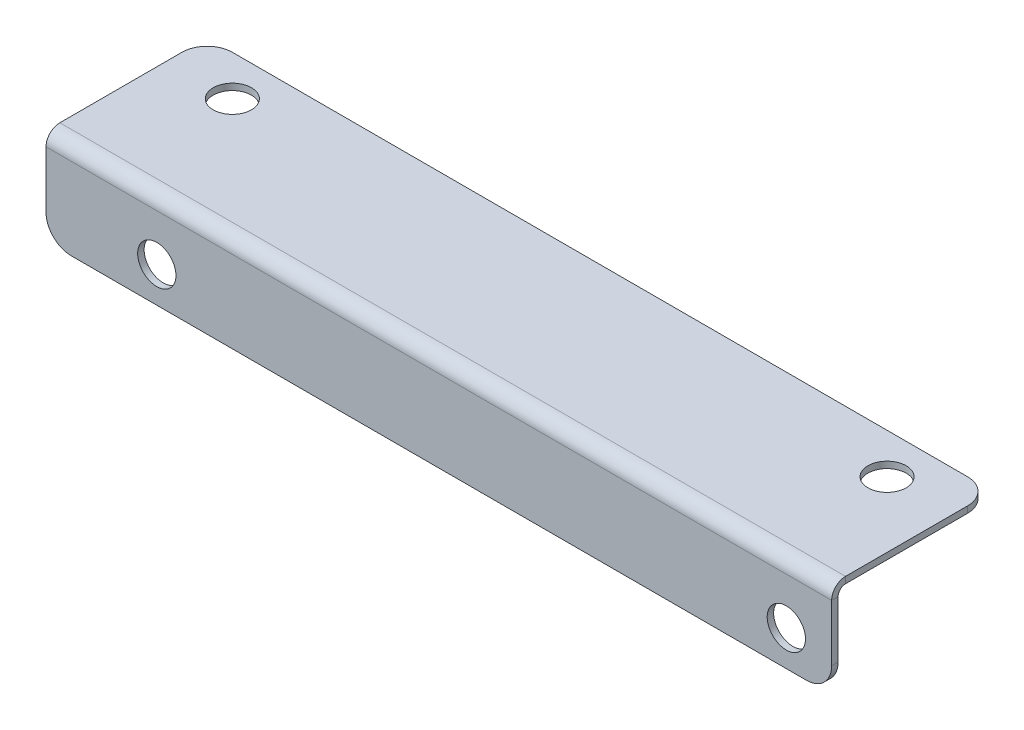
ISO-10303-21;
HEADER;
FILE_DESCRIPTION(('STEP AP214'),'2;1');
FILE_NAME('part.step','',(''),(''),'','','');
FILE_SCHEMA(('AUTOMOTIVE_DESIGN { 1 0 10303 214 1 1 1 1 }'));
ENDSEC;
DATA;
#1=APPLICATION_CONTEXT('core data for automotive mechanical design processes');
#2=APPLICATION_PROTOCOL_DEFINITION('international standard','automotive_design',2000,#1);
#3=PRODUCT_CONTEXT('',#1,'mechanical');
#4=PRODUCT('Part','Part','',(#3));
#5=PRODUCT_RELATED_PRODUCT_CATEGORY('part','',(#4));
#6=PRODUCT_DEFINITION_FORMATION('','',#4);
#7=PRODUCT_DEFINITION_CONTEXT('part definition',#1,'design');
#8=PRODUCT_DEFINITION('design','',#6,#7);
#9=PRODUCT_DEFINITION_SHAPE('','',#8);
#10=(LENGTH_UNIT() NAMED_UNIT(*) SI_UNIT(.MILLI.,.METRE.));
#11=(NAMED_UNIT(*) PLANE_ANGLE_UNIT() SI_UNIT($,.RADIAN.));
#12=(NAMED_UNIT(*) SI_UNIT($,.STERADIAN.) SOLID_ANGLE_UNIT());
#13=UNCERTAINTY_MEASURE_WITH_UNIT(LENGTH_MEASURE(1.E-05),#10,'distance_accuracy_value','');
#14=(GEOMETRIC_REPRESENTATION_CONTEXT(3) GLOBAL_UNCERTAINTY_ASSIGNED_CONTEXT((#13)) GLOBAL_UNIT_ASSIGNED_CONTEXT((#10,
#11,#12)) REPRESENTATION_CONTEXT('',''));
#15=CARTESIAN_POINT('',(0.,0.,0.));
#16=DIRECTION('',(0.,0.,1.));
#17=DIRECTION('',(1.,0.,0.));
#18=AXIS2_PLACEMENT_3D('',#15,#16,#17);
#19=CARTESIAN_POINT('',(70.4793304129837,-1.52985665092597,-0.64));
#20=DIRECTION('',(1.,0.,0.));
#21=DIRECTION('',(0.,0.,-1.));
#22=AXIS2_PLACEMENT_3D('',#19,#20,#21);
#23=PLANE('',#22);
#24=DIRECTION('',(0.,1.,0.));
#25=VECTOR('',#24,1.);
#26=CARTESIAN_POINT('',(70.4793304129837,-1.52985665092597,0.));
#27=LINE('',#26,#25);
#28=CARTESIAN_POINT('',(70.4793304129837,0.97014334907403,0.));
#29=VERTEX_POINT('',#28);
#30=CARTESIAN_POINT('',(70.4793304129837,6.59354334907403,0.));
#31=VERTEX_POINT('',#30);
#32=EDGE_CURVE('E214',#29,#31,#27,.T.);
#33=ORIENTED_EDGE('',*,*,#32,.F.);
#34=DIRECTION('',(0.,0.,1.));
#35=VECTOR('',#34,1.);
#36=CARTESIAN_POINT('',(70.4793304129837,0.97014334907403,-0.64));
#37=LINE('',#36,#35);
#38=CARTESIAN_POINT('',(70.4793304129837,0.97014334907403,-0.64));
#39=VERTEX_POINT('',#38);
#40=EDGE_CURVE('E13',#29,#39,#37,.F.);
#41=ORIENTED_EDGE('',*,*,#40,.T.);
#42=DIRECTION('',(0.,1.,0.));
#43=VECTOR('',#42,1.);
#44=CARTESIAN_POINT('',(70.4793304129837,-1.52985665092597,-0.64));
#45=LINE('',#44,#43);
#46=CARTESIAN_POINT('',(70.4793304129837,6.59354334907403,-0.64));
#47=VERTEX_POINT('',#46);
#48=EDGE_CURVE('E218',#39,#47,#45,.T.);
#49=ORIENTED_EDGE('',*,*,#48,.T.);
#50=DIRECTION('',(0.,0.,1.));
#51=VECTOR('',#50,1.);
#52=CARTESIAN_POINT('',(70.4793304129837,6.59354334907403,-0.640000000000006));
#53=LINE('',#52,#51);
#54=EDGE_CURVE('E196',#47,#31,#53,.T.);
#55=ORIENTED_EDGE('',*,*,#54,.T.);
#56=EDGE_LOOP('',(#33,#41,#49,#55));
#57=FACE_BOUND('',#56,.T.);
#58=ADVANCED_FACE('F63',(#57),#23,.T.);
#59=CARTESIAN_POINT('',(0.,0.,-0.64));
#60=DIRECTION('',(0.,0.,-1.));
#61=DIRECTION('',(-1.,0.,0.));
#62=AXIS2_PLACEMENT_3D('',#59,#60,#61);
#63=PLANE('',#62);
#64=CARTESIAN_POINT('',(3.47933041298369,1.97014334907403,-0.64));
#65=DIRECTION('',(0.,0.,1.));
#66=DIRECTION('',(1.,0.,0.));
#67=AXIS2_PLACEMENT_3D('',#64,#65,#66);
#68=CIRCLE('',#67,1.9);
#69=CARTESIAN_POINT('',(5.37933041298369,1.97014334907403,-0.64));
#70=VERTEX_POINT('',#69);
#71=EDGE_CURVE('E193',#70,#70,#68,.T.);
#72=ORIENTED_EDGE('',*,*,#71,.T.);
#73=EDGE_LOOP('',(#72));
#74=FACE_BOUND('',#73,.T.);
#75=CARTESIAN_POINT('',(65.9793304129837,1.97014334907403,-0.64));
#76=DIRECTION('',(0.,0.,1.));
#77=DIRECTION('',(1.,0.,0.));
#78=AXIS2_PLACEMENT_3D('',#75,#76,#77);
#79=CIRCLE('',#78,1.9);
#80=CARTESIAN_POINT('',(67.8793304129837,1.97014334907403,-0.64));
#81=VERTEX_POINT('',#80);
#82=EDGE_CURVE('E282',#81,#81,#79,.T.);
#83=ORIENTED_EDGE('',*,*,#82,.T.);
#84=EDGE_LOOP('',(#83));
#85=FACE_BOUND('',#84,.T.);
#86=DIRECTION('',(1.,0.,0.));
#87=VECTOR('',#86,1.);
#88=CARTESIAN_POINT('',(-7.52066958701631,-1.52985665092597,-0.64));
#89=LINE('',#88,#87);
#90=CARTESIAN_POINT('',(-5.02066958701631,-1.52985665092597,-0.64));
#91=VERTEX_POINT('',#90);
#92=CARTESIAN_POINT('',(67.9793304129837,-1.52985665092597,-0.64));
#93=VERTEX_POINT('',#92);
#94=EDGE_CURVE('E213',#91,#93,#89,.T.);
#95=ORIENTED_EDGE('',*,*,#94,.F.);
#96=CARTESIAN_POINT('',(-5.02066958701631,0.970143349074029,-0.64));
#97=DIRECTION('',(0.,0.,-1.));
#98=DIRECTION('',(-1.,0.,0.));
#99=AXIS2_PLACEMENT_3D('',#96,#97,#98);
#100=CIRCLE('',#99,2.5);
#101=CARTESIAN_POINT('',(-7.52066958701631,0.970143349074029,-0.64));
#102=VERTEX_POINT('',#101);
#103=EDGE_CURVE('E241',#91,#102,#100,.T.);
#104=ORIENTED_EDGE('',*,*,#103,.T.);
#105=DIRECTION('',(0.,-1.,0.));
#106=VECTOR('',#105,1.);
#107=CARTESIAN_POINT('',(-7.52066958701631,-1.52985665092597,-0.64));
#108=LINE('',#107,#106);
#109=CARTESIAN_POINT('',(-7.52066958701631,6.59354334907403,-0.64));
#110=VERTEX_POINT('',#109);
#111=EDGE_CURVE('E210',#110,#102,#108,.T.);
#112=ORIENTED_EDGE('',*,*,#111,.F.);
#113=DIRECTION('',(1.,0.,0.));
#114=VECTOR('',#113,1.);
#115=CARTESIAN_POINT('',(70.4793304129837,6.59354334907403,-0.640000000000006));
#116=LINE('',#115,#114);
#117=EDGE_CURVE('E200',#47,#110,#116,.F.);
#118=ORIENTED_EDGE('',*,*,#117,.F.);
#119=ORIENTED_EDGE('',*,*,#48,.F.);
#120=CARTESIAN_POINT('',(67.9793304129837,0.97014334907403,-0.64));
#121=DIRECTION('',(0.,0.,-1.));
#122=DIRECTION('',(-1.,0.,0.));
#123=AXIS2_PLACEMENT_3D('',#120,#121,#122);
#124=CIRCLE('',#123,2.5);
#125=EDGE_CURVE('E239',#39,#93,#124,.T.);
#126=ORIENTED_EDGE('',*,*,#125,.T.);
#127=EDGE_LOOP('',(#95,#104,#112,#118,#119,#126));
#128=FACE_BOUND('',#127,.T.);
#129=ADVANCED_FACE('F330',(#74,#85,#128),#63,.T.);
#130=CARTESIAN_POINT('',(0.,0.,0.));
#131=DIRECTION('',(0.,0.,-1.));
#132=DIRECTION('',(-1.,0.,0.));
#133=AXIS2_PLACEMENT_3D('',#130,#131,#132);
#134=PLANE('',#133);
#135=CARTESIAN_POINT('',(3.47933041298369,1.97014334907403,0.));
#136=DIRECTION('',(0.,0.,1.));
#137=DIRECTION('',(1.,0.,0.));
#138=AXIS2_PLACEMENT_3D('',#135,#136,#137);
#139=CIRCLE('',#138,1.9);
#140=CARTESIAN_POINT('',(5.37933041298369,1.97014334907403,0.));
#141=VERTEX_POINT('',#140);
#142=EDGE_CURVE('E286',#141,#141,#139,.T.);
#143=ORIENTED_EDGE('',*,*,#142,.F.);
#144=EDGE_LOOP('',(#143));
#145=FACE_BOUND('',#144,.T.);
#146=CARTESIAN_POINT('',(65.9793304129837,1.97014334907403,0.));
#147=DIRECTION('',(0.,0.,1.));
#148=DIRECTION('',(1.,0.,0.));
#149=AXIS2_PLACEMENT_3D('',#146,#147,#148);
#150=CIRCLE('',#149,1.9);
#151=CARTESIAN_POINT('',(67.8793304129837,1.97014334907403,0.));
#152=VERTEX_POINT('',#151);
#153=EDGE_CURVE('E279',#152,#152,#150,.T.);
#154=ORIENTED_EDGE('',*,*,#153,.F.);
#155=EDGE_LOOP('',(#154));
#156=FACE_BOUND('',#155,.T.);
#157=DIRECTION('',(0.,-1.,0.));
#158=VECTOR('',#157,1.);
#159=CARTESIAN_POINT('',(-7.52066958701631,-1.52985665092597,0.));
#160=LINE('',#159,#158);
#161=CARTESIAN_POINT('',(-7.52066958701631,6.59354334907403,0.));
#162=VERTEX_POINT('',#161);
#163=CARTESIAN_POINT('',(-7.52066958701631,0.970143349074029,0.));
#164=VERTEX_POINT('',#163);
#165=EDGE_CURVE('E207',#162,#164,#160,.T.);
#166=ORIENTED_EDGE('',*,*,#165,.T.);
#167=CARTESIAN_POINT('',(-5.02066958701631,0.970143349074029,0.));
#168=DIRECTION('',(0.,0.,-1.));
#169=DIRECTION('',(-1.,0.,0.));
#170=AXIS2_PLACEMENT_3D('',#167,#168,#169);
#171=CIRCLE('',#170,2.5);
#172=CARTESIAN_POINT('',(-5.02066958701631,-1.52985665092597,0.));
#173=VERTEX_POINT('',#172);
#174=EDGE_CURVE('E232',#164,#173,#171,.F.);
#175=ORIENTED_EDGE('',*,*,#174,.T.);
#176=DIRECTION('',(1.,0.,0.));
#177=VECTOR('',#176,1.);
#178=CARTESIAN_POINT('',(-7.52066958701631,-1.52985665092597,0.));
#179=LINE('',#178,#177);
#180=CARTESIAN_POINT('',(67.9793304129837,-1.52985665092597,0.));
#181=VERTEX_POINT('',#180);
#182=EDGE_CURVE('E223',#173,#181,#179,.T.);
#183=ORIENTED_EDGE('',*,*,#182,.T.);
#184=CARTESIAN_POINT('',(67.9793304129837,0.97014334907403,0.));
#185=DIRECTION('',(0.,0.,-1.));
#186=DIRECTION('',(-1.,0.,0.));
#187=AXIS2_PLACEMENT_3D('',#184,#185,#186);
#188=CIRCLE('',#187,2.5);
#189=EDGE_CURVE('E230',#181,#29,#188,.F.);
#190=ORIENTED_EDGE('',*,*,#189,.T.);
#191=ORIENTED_EDGE('',*,*,#32,.T.);
#192=DIRECTION('',(1.,0.,0.));
#193=VECTOR('',#192,1.);
#194=CARTESIAN_POINT('',(70.4793304129837,6.59354334907403,0.));
#195=LINE('',#194,#193);
#196=EDGE_CURVE('E167',#31,#162,#195,.F.);
#197=ORIENTED_EDGE('',*,*,#196,.T.);
#198=EDGE_LOOP('',(#166,#175,#183,#190,#191,#197));
#199=FACE_BOUND('',#198,.T.);
#200=ADVANCED_FACE('F336',(#145,#156,#199),#134,.F.);
#201=CARTESIAN_POINT('',(-7.52066958701631,-1.52985665092597,-0.64));
#202=DIRECTION('',(-1.,0.,0.));
#203=DIRECTION('',(0.,0.,1.));
#204=AXIS2_PLACEMENT_3D('',#201,#202,#203);
#205=PLANE('',#204);
#206=ORIENTED_EDGE('',*,*,#111,.T.);
#207=DIRECTION('',(0.,0.,1.));
#208=VECTOR('',#207,1.);
#209=CARTESIAN_POINT('',(-7.52066958701631,0.970143349074029,-0.64));
#210=LINE('',#209,#208);
#211=EDGE_CURVE('E220',#102,#164,#210,.T.);
#212=ORIENTED_EDGE('',*,*,#211,.T.);
#213=ORIENTED_EDGE('',*,*,#165,.F.);
#214=DIRECTION('',(0.,0.,1.));
#215=VECTOR('',#214,1.);
#216=CARTESIAN_POINT('',(-7.5206695870163,6.59354334907403,-0.639999999999994));
#217=LINE('',#216,#215);
#218=EDGE_CURVE('E204',#110,#162,#217,.T.);
#219=ORIENTED_EDGE('',*,*,#218,.F.);
#220=EDGE_LOOP('',(#206,#212,#213,#219));
#221=FACE_BOUND('',#220,.T.);
#222=ADVANCED_FACE('F346',(#221),#205,.T.);
#223=CARTESIAN_POINT('',(-7.52066958701631,-1.52985665092597,-0.64));
#224=DIRECTION('',(0.,-1.,0.));
#225=DIRECTION('',(0.,0.,-1.));
#226=AXIS2_PLACEMENT_3D('',#223,#224,#225);
#227=PLANE('',#226);
#228=ORIENTED_EDGE('',*,*,#182,.F.);
#229=DIRECTION('',(0.,0.,1.));
#230=VECTOR('',#229,1.);
#231=CARTESIAN_POINT('',(-5.02066958701631,-1.52985665092597,-0.64));
#232=LINE('',#231,#230);
#233=EDGE_CURVE('E237',#173,#91,#232,.F.);
#234=ORIENTED_EDGE('',*,*,#233,.T.);
#235=ORIENTED_EDGE('',*,*,#94,.T.);
#236=DIRECTION('',(0.,0.,1.));
#237=VECTOR('',#236,1.);
#238=CARTESIAN_POINT('',(67.9793304129837,-1.52985665092597,-0.64));
#239=LINE('',#238,#237);
#240=EDGE_CURVE('E234',#93,#181,#239,.T.);
#241=ORIENTED_EDGE('',*,*,#240,.T.);
#242=EDGE_LOOP('',(#228,#234,#235,#241));
#243=FACE_BOUND('',#242,.T.);
#244=ADVANCED_FACE('F342',(#243),#227,.T.);
#245=CARTESIAN_POINT('',(-7.5206695870163,6.59354334907403,-1.37659999999999));
#246=DIRECTION('',(-1.,0.,0.));
#247=DIRECTION('',(0.,0.,1.));
#248=AXIS2_PLACEMENT_3D('',#245,#246,#247);
#249=PLANE('',#248);
#250=DIRECTION('',(0.,1.,0.));
#251=VECTOR('',#250,1.);
#252=CARTESIAN_POINT('',(-7.52066958701631,7.97014334907403,-1.37659999999999));
#253=LINE('',#252,#251);
#254=CARTESIAN_POINT('',(-7.5206695870163,7.33014334907403,-1.37659999999999));
#255=VERTEX_POINT('',#254);
#256=CARTESIAN_POINT('',(-7.5206695870163,7.97014334907403,-1.37659999999999));
#257=VERTEX_POINT('',#256);
#258=EDGE_CURVE('E190',#255,#257,#253,.T.);
#259=ORIENTED_EDGE('',*,*,#258,.F.);
#260=CARTESIAN_POINT('',(-7.5206695870163,6.59354334907403,-1.37659999999999));
#261=DIRECTION('',(1.,0.,0.));
#262=DIRECTION('',(0.,0.,-1.));
#263=AXIS2_PLACEMENT_3D('',#260,#261,#262);
#264=CIRCLE('',#263,0.7366);
#265=EDGE_CURVE('E170',#110,#255,#264,.F.);
#266=ORIENTED_EDGE('',*,*,#265,.F.);
#267=ORIENTED_EDGE('',*,*,#218,.T.);
#268=CARTESIAN_POINT('',(-7.5206695870163,6.59354334907403,-1.37659999999999));
#269=DIRECTION('',(1.,0.,0.));
#270=DIRECTION('',(0.,0.,-1.));
#271=AXIS2_PLACEMENT_3D('',#268,#269,#270);
#272=CIRCLE('',#271,1.3766);
#273=EDGE_CURVE('E195',#162,#257,#272,.F.);
#274=ORIENTED_EDGE('',*,*,#273,.T.);
#275=EDGE_LOOP('',(#259,#266,#267,#274));
#276=FACE_BOUND('',#275,.T.);
#277=ADVANCED_FACE('F345',(#276),#249,.T.);
#278=CARTESIAN_POINT('',(70.4793304129837,6.59354334907403,-1.37660000000001));
#279=DIRECTION('',(-1.,0.,0.));
#280=DIRECTION('',(0.,0.,1.));
#281=AXIS2_PLACEMENT_3D('',#278,#279,#280);
#282=PLANE('',#281);
#283=CARTESIAN_POINT('',(70.4793304129837,6.59354334907403,-1.37660000000001));
#284=DIRECTION('',(1.,0.,0.));
#285=DIRECTION('',(0.,0.,-1.));
#286=AXIS2_PLACEMENT_3D('',#283,#284,#285);
#287=CIRCLE('',#286,0.7366);
#288=CARTESIAN_POINT('',(70.4793304129837,7.33014334907403,-1.3766));
#289=VERTEX_POINT('',#288);
#290=EDGE_CURVE('E156',#289,#47,#287,.T.);
#291=ORIENTED_EDGE('',*,*,#290,.F.);
#292=DIRECTION('',(0.,1.,0.));
#293=VECTOR('',#292,1.);
#294=CARTESIAN_POINT('',(70.4793304129837,7.33014334907403,-1.3766));
#295=LINE('',#294,#293);
#296=CARTESIAN_POINT('',(70.4793304129837,7.97014334907403,-1.3766));
#297=VERTEX_POINT('',#296);
#298=EDGE_CURVE('E154',#289,#297,#295,.T.);
#299=ORIENTED_EDGE('',*,*,#298,.T.);
#300=CARTESIAN_POINT('',(70.4793304129837,6.59354334907403,-1.37660000000001));
#301=DIRECTION('',(1.,0.,0.));
#302=DIRECTION('',(0.,0.,-1.));
#303=AXIS2_PLACEMENT_3D('',#300,#301,#302);
#304=CIRCLE('',#303,1.3766);
#305=EDGE_CURVE('E162',#297,#31,#304,.T.);
#306=ORIENTED_EDGE('',*,*,#305,.T.);
#307=ORIENTED_EDGE('',*,*,#54,.F.);
#308=EDGE_LOOP('',(#291,#299,#306,#307));
#309=FACE_BOUND('',#308,.T.);
#310=ADVANCED_FACE('F173',(#309),#282,.F.);
#311=CARTESIAN_POINT('',(70.4793304129837,6.59354334907403,-1.37660000000001));
#312=DIRECTION('',(1.,0.,0.));
#313=DIRECTION('',(0.,1.,0.));
#314=AXIS2_PLACEMENT_3D('',#311,#312,#313);
#315=CYLINDRICAL_SURFACE('',#314,1.3766);
#316=ORIENTED_EDGE('',*,*,#196,.F.);
#317=ORIENTED_EDGE('',*,*,#305,.F.);
#318=DIRECTION('',(1.,0.,0.));
#319=VECTOR('',#318,1.);
#320=CARTESIAN_POINT('',(0.,7.97014334907403,-1.37659999999999));
#321=LINE('',#320,#319);
#322=EDGE_CURVE('E165',#257,#297,#321,.T.);
#323=ORIENTED_EDGE('',*,*,#322,.F.);
#324=ORIENTED_EDGE('',*,*,#273,.F.);
#325=EDGE_LOOP('',(#316,#317,#323,#324));
#326=FACE_BOUND('',#325,.T.);
#327=ADVANCED_FACE('F163',(#326),#315,.T.);
#328=CARTESIAN_POINT('',(70.4793304129837,6.59354334907403,-1.37660000000001));
#329=DIRECTION('',(1.,0.,0.));
#330=DIRECTION('',(0.,1.,0.));
#331=AXIS2_PLACEMENT_3D('',#328,#329,#330);
#332=CYLINDRICAL_SURFACE('',#331,0.7366);
#333=ORIENTED_EDGE('',*,*,#117,.T.);
#334=ORIENTED_EDGE('',*,*,#265,.T.);
#335=DIRECTION('',(-1.,0.,0.));
#336=VECTOR('',#335,1.);
#337=CARTESIAN_POINT('',(-7.52066958701631,7.33014334907403,-1.3766));
#338=LINE('',#337,#336);
#339=EDGE_CURVE('E175',#255,#289,#338,.F.);
#340=ORIENTED_EDGE('',*,*,#339,.T.);
#341=ORIENTED_EDGE('',*,*,#290,.T.);
#342=EDGE_LOOP('',(#333,#334,#340,#341));
#343=FACE_BOUND('',#342,.T.);
#344=ADVANCED_FACE('F363',(#343),#332,.F.);
#345=CARTESIAN_POINT('',(70.4793304129837,7.97014334907403,-0.639999999999998));
#346=DIRECTION('',(1.,0.,0.));
#347=DIRECTION('',(0.,0.,-1.));
#348=AXIS2_PLACEMENT_3D('',#345,#346,#347);
#349=PLANE('',#348);
#350=DIRECTION('',(0.,0.,-1.));
#351=VECTOR('',#350,1.);
#352=CARTESIAN_POINT('',(70.4793304129837,7.33014334907403,0.));
#353=LINE('',#352,#351);
#354=CARTESIAN_POINT('',(70.4793304129837,7.33014334907407,-13.5));
#355=VERTEX_POINT('',#354);
#356=EDGE_CURVE('E265',#355,#289,#353,.F.);
#357=ORIENTED_EDGE('',*,*,#356,.F.);
#358=DIRECTION('',(0.,-1.,0.));
#359=VECTOR('',#358,1.);
#360=CARTESIAN_POINT('',(70.4793304129837,7.97014334907407,-13.5));
#361=LINE('',#360,#359);
#362=CARTESIAN_POINT('',(70.4793304129837,7.97014334907407,-13.5));
#363=VERTEX_POINT('',#362);
#364=EDGE_CURVE('E71',#355,#363,#361,.F.);
#365=ORIENTED_EDGE('',*,*,#364,.T.);
#366=DIRECTION('',(0.,0.,1.));
#367=VECTOR('',#366,1.);
#368=CARTESIAN_POINT('',(70.4793304129837,7.97014334907403,-0.639999999999998));
#369=LINE('',#368,#367);
#370=EDGE_CURVE('E150',#363,#297,#369,.T.);
#371=ORIENTED_EDGE('',*,*,#370,.T.);
#372=ORIENTED_EDGE('',*,*,#298,.F.);
#373=EDGE_LOOP('',(#357,#365,#371,#372));
#374=FACE_BOUND('',#373,.T.);
#375=ADVANCED_FACE('F152',(#374),#349,.T.);
#376=CARTESIAN_POINT('',(-7.52066958701631,7.97014334907408,-16.));
#377=DIRECTION('',(-1.,0.,0.));
#378=DIRECTION('',(0.,0.,1.));
#379=AXIS2_PLACEMENT_3D('',#376,#377,#378);
#380=PLANE('',#379);
#381=DIRECTION('',(0.,0.,-1.));
#382=VECTOR('',#381,1.);
#383=CARTESIAN_POINT('',(-7.52066958701631,7.97014334907408,-16.));
#384=LINE('',#383,#382);
#385=CARTESIAN_POINT('',(-7.52066958701631,7.97014334907407,-13.5));
#386=VERTEX_POINT('',#385);
#387=EDGE_CURVE('E180',#257,#386,#384,.T.);
#388=ORIENTED_EDGE('',*,*,#387,.T.);
#389=DIRECTION('',(0.,-1.,0.));
#390=VECTOR('',#389,1.);
#391=CARTESIAN_POINT('',(-7.52066958701631,7.97014334907407,-13.5));
#392=LINE('',#391,#390);
#393=CARTESIAN_POINT('',(-7.52066958701631,7.33014334907407,-13.5));
#394=VERTEX_POINT('',#393);
#395=EDGE_CURVE('E243',#386,#394,#392,.T.);
#396=ORIENTED_EDGE('',*,*,#395,.T.);
#397=DIRECTION('',(0.,0.,1.));
#398=VECTOR('',#397,1.);
#399=CARTESIAN_POINT('',(-7.52066958701631,7.33014334907403,0.));
#400=LINE('',#399,#398);
#401=EDGE_CURVE('E181',#255,#394,#400,.F.);
#402=ORIENTED_EDGE('',*,*,#401,.F.);
#403=ORIENTED_EDGE('',*,*,#258,.T.);
#404=EDGE_LOOP('',(#388,#396,#402,#403));
#405=FACE_BOUND('',#404,.T.);
#406=ADVANCED_FACE('F263',(#405),#380,.T.);
#407=CARTESIAN_POINT('',(0.,7.97014334907403,0.));
#408=DIRECTION('',(0.,1.,0.));
#409=DIRECTION('',(0.,0.,1.));
#410=AXIS2_PLACEMENT_3D('',#407,#408,#409);
#411=PLANE('',#410);
#412=CARTESIAN_POINT('',(-1.0206695870163,7.97014334907407,-12.));
#413=DIRECTION('',(0.,1.,0.));
#414=DIRECTION('',(0.,0.,1.));
#415=AXIS2_PLACEMENT_3D('',#412,#413,#414);
#416=CIRCLE('',#415,1.9);
#417=CARTESIAN_POINT('',(-1.0206695870163,7.97014334907407,-10.1));
#418=VERTEX_POINT('',#417);
#419=EDGE_CURVE('E297',#418,#418,#416,.T.);
#420=ORIENTED_EDGE('',*,*,#419,.F.);
#421=EDGE_LOOP('',(#420));
#422=FACE_BOUND('',#421,.T.);
#423=CARTESIAN_POINT('',(63.9793304129837,7.97014334907407,-12.));
#424=DIRECTION('',(0.,1.,0.));
#425=DIRECTION('',(0.,0.,-1.));
#426=AXIS2_PLACEMENT_3D('',#423,#424,#425);
#427=CIRCLE('',#426,1.90000000000002);
#428=CARTESIAN_POINT('',(63.9793304129837,7.97014334907407,-10.1));
#429=VERTEX_POINT('',#428);
#430=EDGE_CURVE('E291',#429,#429,#427,.T.);
#431=ORIENTED_EDGE('',*,*,#430,.F.);
#432=EDGE_LOOP('',(#431));
#433=FACE_BOUND('',#432,.T.);
#434=DIRECTION('',(1.,0.,0.));
#435=VECTOR('',#434,1.);
#436=CARTESIAN_POINT('',(70.4793304129837,7.97014334907408,-16.));
#437=LINE('',#436,#435);
#438=CARTESIAN_POINT('',(-5.02066958701632,7.97014334907408,-16.));
#439=VERTEX_POINT('',#438);
#440=CARTESIAN_POINT('',(67.9793304129837,7.97014334907408,-16.));
#441=VERTEX_POINT('',#440);
#442=EDGE_CURVE('E157',#439,#441,#437,.T.);
#443=ORIENTED_EDGE('',*,*,#442,.F.);
#444=CARTESIAN_POINT('',(-5.02066958701631,7.97014334907407,-13.5));
#445=DIRECTION('',(0.,1.,0.));
#446=DIRECTION('',(0.,0.,1.));
#447=AXIS2_PLACEMENT_3D('',#444,#445,#446);
#448=CIRCLE('',#447,2.5);
#449=EDGE_CURVE('E257',#439,#386,#448,.T.);
#450=ORIENTED_EDGE('',*,*,#449,.T.);
#451=ORIENTED_EDGE('',*,*,#387,.F.);
#452=ORIENTED_EDGE('',*,*,#322,.T.);
#453=ORIENTED_EDGE('',*,*,#370,.F.);
#454=CARTESIAN_POINT('',(67.9793304129837,7.97014334907407,-13.5));
#455=DIRECTION('',(0.,1.,0.));
#456=DIRECTION('',(0.,0.,1.));
#457=AXIS2_PLACEMENT_3D('',#454,#455,#456);
#458=CIRCLE('',#457,2.5);
#459=EDGE_CURVE('E84',#363,#441,#458,.T.);
#460=ORIENTED_EDGE('',*,*,#459,.T.);
#461=EDGE_LOOP('',(#443,#450,#451,#452,#453,#460));
#462=FACE_BOUND('',#461,.T.);
#463=ADVANCED_FACE('F178',(#422,#433,#462),#411,.T.);
#464=CARTESIAN_POINT('',(0.,7.33014334907403,0.));
#465=DIRECTION('',(0.,1.,0.));
#466=DIRECTION('',(0.,0.,1.));
#467=AXIS2_PLACEMENT_3D('',#464,#465,#466);
#468=PLANE('',#467);
#469=CARTESIAN_POINT('',(-1.0206695870163,7.33014334907407,-12.));
#470=DIRECTION('',(0.,1.,0.));
#471=DIRECTION('',(0.,0.,1.));
#472=AXIS2_PLACEMENT_3D('',#469,#470,#471);
#473=CIRCLE('',#472,1.9);
#474=CARTESIAN_POINT('',(-1.0206695870163,7.33014334907406,-10.1));
#475=VERTEX_POINT('',#474);
#476=EDGE_CURVE('E283',#475,#475,#473,.T.);
#477=ORIENTED_EDGE('',*,*,#476,.T.);
#478=EDGE_LOOP('',(#477));
#479=FACE_BOUND('',#478,.T.);
#480=CARTESIAN_POINT('',(63.9793304129837,7.33014334907407,-12.));
#481=DIRECTION('',(0.,1.,0.));
#482=DIRECTION('',(0.,0.,-1.));
#483=AXIS2_PLACEMENT_3D('',#480,#481,#482);
#484=CIRCLE('',#483,1.90000000000002);
#485=CARTESIAN_POINT('',(63.9793304129837,7.33014334907406,-10.1));
#486=VERTEX_POINT('',#485);
#487=EDGE_CURVE('E294',#486,#486,#484,.T.);
#488=ORIENTED_EDGE('',*,*,#487,.T.);
#489=EDGE_LOOP('',(#488));
#490=FACE_BOUND('',#489,.T.);
#491=ORIENTED_EDGE('',*,*,#401,.T.);
#492=CARTESIAN_POINT('',(-5.02066958701631,7.33014334907407,-13.5));
#493=DIRECTION('',(0.,1.,0.));
#494=DIRECTION('',(0.,0.,1.));
#495=AXIS2_PLACEMENT_3D('',#492,#493,#494);
#496=CIRCLE('',#495,2.5);
#497=CARTESIAN_POINT('',(-5.02066958701631,7.33014334907408,-16.));
#498=VERTEX_POINT('',#497);
#499=EDGE_CURVE('E249',#394,#498,#496,.F.);
#500=ORIENTED_EDGE('',*,*,#499,.T.);
#501=DIRECTION('',(-1.,0.,0.));
#502=VECTOR('',#501,1.);
#503=CARTESIAN_POINT('',(0.,7.33014334907408,-16.));
#504=LINE('',#503,#502);
#505=CARTESIAN_POINT('',(67.9793304129837,7.33014334907408,-16.));
#506=VERTEX_POINT('',#505);
#507=EDGE_CURVE('E184',#498,#506,#504,.F.);
#508=ORIENTED_EDGE('',*,*,#507,.T.);
#509=CARTESIAN_POINT('',(67.9793304129837,7.33014334907407,-13.5));
#510=DIRECTION('',(0.,1.,0.));
#511=DIRECTION('',(0.,0.,1.));
#512=AXIS2_PLACEMENT_3D('',#509,#510,#511);
#513=CIRCLE('',#512,2.5);
#514=EDGE_CURVE('E246',#506,#355,#513,.F.);
#515=ORIENTED_EDGE('',*,*,#514,.T.);
#516=ORIENTED_EDGE('',*,*,#356,.T.);
#517=ORIENTED_EDGE('',*,*,#339,.F.);
#518=EDGE_LOOP('',(#491,#500,#508,#515,#516,#517));
#519=FACE_BOUND('',#518,.T.);
#520=ADVANCED_FACE('F271',(#479,#490,#519),#468,.F.);
#521=CARTESIAN_POINT('',(70.4793304129837,7.97014334907408,-16.));
#522=DIRECTION('',(0.,0.,-1.));
#523=DIRECTION('',(0.,1.,0.));
#524=AXIS2_PLACEMENT_3D('',#521,#522,#523);
#525=PLANE('',#524);
#526=ORIENTED_EDGE('',*,*,#507,.F.);
#527=DIRECTION('',(0.,-1.,0.));
#528=VECTOR('',#527,1.);
#529=CARTESIAN_POINT('',(-5.02066958701632,7.97014334907408,-16.));
#530=LINE('',#529,#528);
#531=EDGE_CURVE('E254',#498,#439,#530,.F.);
#532=ORIENTED_EDGE('',*,*,#531,.T.);
#533=ORIENTED_EDGE('',*,*,#442,.T.);
#534=DIRECTION('',(0.,-1.,0.));
#535=VECTOR('',#534,1.);
#536=CARTESIAN_POINT('',(67.9793304129837,7.97014334907408,-16.));
#537=LINE('',#536,#535);
#538=EDGE_CURVE('E251',#441,#506,#537,.T.);
#539=ORIENTED_EDGE('',*,*,#538,.T.);
#540=EDGE_LOOP('',(#526,#532,#533,#539));
#541=FACE_BOUND('',#540,.T.);
#542=ADVANCED_FACE('F274',(#541),#525,.T.);
#543=CARTESIAN_POINT('',(65.9793304129837,1.97014334907403,-0.64));
#544=DIRECTION('',(0.,0.,1.));
#545=DIRECTION('',(1.,0.,0.));
#546=AXIS2_PLACEMENT_3D('',#543,#544,#545);
#547=CYLINDRICAL_SURFACE('',#546,1.9);
#548=CARTESIAN_POINT('',(67.8793304129837,1.97014334907403,-0.64));
#549=CARTESIAN_POINT('',(67.8793304129837,1.97014334907403,-0.633333333333333));
#550=CARTESIAN_POINT('',(67.8793304129837,1.97014334907403,-0.626666666666667));
#551=CARTESIAN_POINT('',(67.8793304129837,1.97014334907403,-0.613333333333334));
#552=CARTESIAN_POINT('',(67.8793304129837,1.97014334907403,-0.606666666666667));
#553=CARTESIAN_POINT('',(67.8793304129837,1.97014334907403,-0.593333333333333));
#554=CARTESIAN_POINT('',(67.8793304129837,1.97014334907403,-0.586666666666667));
#555=CARTESIAN_POINT('',(67.8793304129837,1.97014334907403,-0.573333333333333));
#556=CARTESIAN_POINT('',(67.8793304129837,1.97014334907403,-0.566666666666667));
#557=CARTESIAN_POINT('',(67.8793304129837,1.97014334907403,-0.553333333333333));
#558=CARTESIAN_POINT('',(67.8793304129837,1.97014334907403,-0.546666666666667));
#559=CARTESIAN_POINT('',(67.8793304129837,1.97014334907403,-0.533333333333333));
#560=CARTESIAN_POINT('',(67.8793304129837,1.97014334907403,-0.526666666666667));
#561=CARTESIAN_POINT('',(67.8793304129837,1.97014334907403,-0.513333333333333));
#562=CARTESIAN_POINT('',(67.8793304129837,1.97014334907403,-0.506666666666667));
#563=CARTESIAN_POINT('',(67.8793304129837,1.97014334907403,-0.493333333333333));
#564=CARTESIAN_POINT('',(67.8793304129837,1.97014334907403,-0.486666666666667));
#565=CARTESIAN_POINT('',(67.8793304129837,1.97014334907403,-0.473333333333333));
#566=CARTESIAN_POINT('',(67.8793304129837,1.97014334907403,-0.466666666666667));
#567=CARTESIAN_POINT('',(67.8793304129837,1.97014334907403,-0.453333333333333));
#568=CARTESIAN_POINT('',(67.8793304129837,1.97014334907403,-0.446666666666667));
#569=CARTESIAN_POINT('',(67.8793304129837,1.97014334907403,-0.433333333333333));
#570=CARTESIAN_POINT('',(67.8793304129837,1.97014334907403,-0.426666666666667));
#571=CARTESIAN_POINT('',(67.8793304129837,1.97014334907403,-0.413333333333333));
#572=CARTESIAN_POINT('',(67.8793304129837,1.97014334907403,-0.406666666666667));
#573=CARTESIAN_POINT('',(67.8793304129837,1.97014334907403,-0.393333333333333));
#574=CARTESIAN_POINT('',(67.8793304129837,1.97014334907403,-0.386666666666667));
#575=CARTESIAN_POINT('',(67.8793304129837,1.97014334907403,-0.373333333333333));
#576=CARTESIAN_POINT('',(67.8793304129837,1.97014334907403,-0.366666666666667));
#577=CARTESIAN_POINT('',(67.8793304129837,1.97014334907403,-0.353333333333333));
#578=CARTESIAN_POINT('',(67.8793304129837,1.97014334907403,-0.346666666666667));
#579=CARTESIAN_POINT('',(67.8793304129837,1.97014334907403,-0.333333333333333));
#580=CARTESIAN_POINT('',(67.8793304129837,1.97014334907403,-0.326666666666667));
#581=CARTESIAN_POINT('',(67.8793304129837,1.97014334907403,-0.313333333333333));
#582=CARTESIAN_POINT('',(67.8793304129837,1.97014334907403,-0.306666666666667));
#583=CARTESIAN_POINT('',(67.8793304129837,1.97014334907403,-0.293333333333333));
#584=CARTESIAN_POINT('',(67.8793304129837,1.97014334907403,-0.286666666666667));
#585=CARTESIAN_POINT('',(67.8793304129837,1.97014334907403,-0.273333333333333));
#586=CARTESIAN_POINT('',(67.8793304129837,1.97014334907403,-0.266666666666667));
#587=CARTESIAN_POINT('',(67.8793304129837,1.97014334907403,-0.253333333333333));
#588=CARTESIAN_POINT('',(67.8793304129837,1.97014334907403,-0.246666666666667));
#589=CARTESIAN_POINT('',(67.8793304129837,1.97014334907403,-0.233333333333333));
#590=CARTESIAN_POINT('',(67.8793304129837,1.97014334907403,-0.226666666666667));
#591=CARTESIAN_POINT('',(67.8793304129837,1.97014334907403,-0.213333333333333));
#592=CARTESIAN_POINT('',(67.8793304129837,1.97014334907403,-0.206666666666667));
#593=CARTESIAN_POINT('',(67.8793304129837,1.97014334907403,-0.193333333333333));
#594=CARTESIAN_POINT('',(67.8793304129837,1.97014334907403,-0.186666666666667));
#595=CARTESIAN_POINT('',(67.8793304129837,1.97014334907403,-0.173333333333333));
#596=CARTESIAN_POINT('',(67.8793304129837,1.97014334907403,-0.166666666666667));
#597=CARTESIAN_POINT('',(67.8793304129837,1.97014334907403,-0.153333333333333));
#598=CARTESIAN_POINT('',(67.8793304129837,1.97014334907403,-0.146666666666667));
#599=CARTESIAN_POINT('',(67.8793304129837,1.97014334907403,-0.133333333333333));
#600=CARTESIAN_POINT('',(67.8793304129837,1.97014334907403,-0.126666666666667));
#601=CARTESIAN_POINT('',(67.8793304129837,1.97014334907403,-0.113333333333333));
#602=CARTESIAN_POINT('',(67.8793304129837,1.97014334907403,-0.106666666666667));
#603=CARTESIAN_POINT('',(67.8793304129837,1.97014334907403,-0.0933333333333334));
#604=CARTESIAN_POINT('',(67.8793304129837,1.97014334907403,-0.0866666666666667));
#605=CARTESIAN_POINT('',(67.8793304129837,1.97014334907403,-0.0733333333333333));
#606=CARTESIAN_POINT('',(67.8793304129837,1.97014334907403,-0.0666666666666667));
#607=CARTESIAN_POINT('',(67.8793304129837,1.97014334907403,-0.0533333333333334));
#608=CARTESIAN_POINT('',(67.8793304129837,1.97014334907403,-0.0466666666666667));
#609=CARTESIAN_POINT('',(67.8793304129837,1.97014334907403,-0.0333333333333333));
#610=CARTESIAN_POINT('',(67.8793304129837,1.97014334907403,-0.0266666666666667));
#611=CARTESIAN_POINT('',(67.8793304129837,1.97014334907403,-0.0133333333333334));
#612=CARTESIAN_POINT('',(67.8793304129837,1.97014334907403,-0.00666666666666668));
#613=CARTESIAN_POINT('',(67.8793304129837,1.97014334907403,0.));
#614=B_SPLINE_CURVE_WITH_KNOTS('',3,(#548,#549,#550,#551,#552,#553,#554,#555,#556,#557,#558,
#559,#560,#561,#562,#563,#564,#565,#566,#567,#568,#569,#570,#571,#572,#573,#574,#575,#576,#577,
#578,#579,#580,#581,#582,#583,#584,#585,#586,#587,#588,#589,#590,#591,#592,#593,#594,#595,#596,
#597,#598,#599,#600,#601,#602,#603,#604,#605,#606,#607,#608,#609,#610,#611,#612,#613),
.UNSPECIFIED.,.F.,.F.,(4,2,2,2,2,2,2,2,2,2,2,2,2,2,2,2,2,2,2,2,2,2,2,2,2,2,2,2,2,2,2,2,4),(0.,
0.0199999999999999,0.04,0.0599999999999999,0.08,0.0999999999999999,0.12,0.14,0.16,0.18,0.2,0.22,
0.24,0.26,0.28,0.3,0.32,0.34,0.36,0.38,0.4,0.42,0.44,0.46,0.48,0.5,0.52,0.54,0.56,0.58,0.6,0.62,
0.64),.UNSPECIFIED.);
#615=EDGE_CURVE('BSEAM325',#81,#152,#614,.T.);
#616=ORIENTED_EDGE('',*,*,#82,.F.);
#617=ORIENTED_EDGE('',*,*,#153,.T.);
#618=ORIENTED_EDGE('',*,*,#615,.T.);
#619=ORIENTED_EDGE('',*,*,#615,.F.);
#620=EDGE_LOOP('',(#616,#618,#617,#619));
#621=FACE_BOUND('',#620,.T.);
#622=ADVANCED_FACE('F325',(#621),#547,.F.);
#623=CARTESIAN_POINT('',(3.47933041298369,1.97014334907403,-0.64));
#624=DIRECTION('',(0.,0.,1.));
#625=DIRECTION('',(1.,0.,0.));
#626=AXIS2_PLACEMENT_3D('',#623,#624,#625);
#627=CYLINDRICAL_SURFACE('',#626,1.9);
#628=CARTESIAN_POINT('',(5.37933041298369,1.97014334907403,-0.64));
#629=CARTESIAN_POINT('',(5.37933041298369,1.97014334907403,-0.633333333333333));
#630=CARTESIAN_POINT('',(5.37933041298369,1.97014334907403,-0.626666666666667));
#631=CARTESIAN_POINT('',(5.37933041298369,1.97014334907403,-0.613333333333334));
#632=CARTESIAN_POINT('',(5.37933041298369,1.97014334907403,-0.606666666666667));
#633=CARTESIAN_POINT('',(5.37933041298369,1.97014334907403,-0.593333333333333));
#634=CARTESIAN_POINT('',(5.37933041298369,1.97014334907403,-0.586666666666667));
#635=CARTESIAN_POINT('',(5.37933041298369,1.97014334907403,-0.573333333333333));
#636=CARTESIAN_POINT('',(5.37933041298369,1.97014334907403,-0.566666666666667));
#637=CARTESIAN_POINT('',(5.37933041298369,1.97014334907403,-0.553333333333333));
#638=CARTESIAN_POINT('',(5.37933041298369,1.97014334907403,-0.546666666666667));
#639=CARTESIAN_POINT('',(5.37933041298369,1.97014334907403,-0.533333333333333));
#640=CARTESIAN_POINT('',(5.37933041298369,1.97014334907403,-0.526666666666667));
#641=CARTESIAN_POINT('',(5.37933041298369,1.97014334907403,-0.513333333333333));
#642=CARTESIAN_POINT('',(5.37933041298369,1.97014334907403,-0.506666666666667));
#643=CARTESIAN_POINT('',(5.37933041298369,1.97014334907403,-0.493333333333333));
#644=CARTESIAN_POINT('',(5.37933041298369,1.97014334907403,-0.486666666666667));
#645=CARTESIAN_POINT('',(5.37933041298369,1.97014334907403,-0.473333333333333));
#646=CARTESIAN_POINT('',(5.37933041298369,1.97014334907403,-0.466666666666667));
#647=CARTESIAN_POINT('',(5.37933041298369,1.97014334907403,-0.453333333333333));
#648=CARTESIAN_POINT('',(5.37933041298369,1.97014334907403,-0.446666666666667));
#649=CARTESIAN_POINT('',(5.37933041298369,1.97014334907403,-0.433333333333333));
#650=CARTESIAN_POINT('',(5.37933041298369,1.97014334907403,-0.426666666666667));
#651=CARTESIAN_POINT('',(5.37933041298369,1.97014334907403,-0.413333333333333));
#652=CARTESIAN_POINT('',(5.37933041298369,1.97014334907403,-0.406666666666667));
#653=CARTESIAN_POINT('',(5.37933041298369,1.97014334907403,-0.393333333333333));
#654=CARTESIAN_POINT('',(5.37933041298369,1.97014334907403,-0.386666666666667));
#655=CARTESIAN_POINT('',(5.37933041298369,1.97014334907403,-0.373333333333333));
#656=CARTESIAN_POINT('',(5.37933041298369,1.97014334907403,-0.366666666666667));
#657=CARTESIAN_POINT('',(5.37933041298369,1.97014334907403,-0.353333333333333));
#658=CARTESIAN_POINT('',(5.37933041298369,1.97014334907403,-0.346666666666667));
#659=CARTESIAN_POINT('',(5.37933041298369,1.97014334907403,-0.333333333333333));
#660=CARTESIAN_POINT('',(5.37933041298369,1.97014334907403,-0.326666666666667));
#661=CARTESIAN_POINT('',(5.37933041298369,1.97014334907403,-0.313333333333333));
#662=CARTESIAN_POINT('',(5.37933041298369,1.97014334907403,-0.306666666666667));
#663=CARTESIAN_POINT('',(5.37933041298369,1.97014334907403,-0.293333333333333));
#664=CARTESIAN_POINT('',(5.37933041298369,1.97014334907403,-0.286666666666667));
#665=CARTESIAN_POINT('',(5.37933041298369,1.97014334907403,-0.273333333333333));
#666=CARTESIAN_POINT('',(5.37933041298369,1.97014334907403,-0.266666666666667));
#667=CARTESIAN_POINT('',(5.37933041298369,1.97014334907403,-0.253333333333333));
#668=CARTESIAN_POINT('',(5.37933041298369,1.97014334907403,-0.246666666666667));
#669=CARTESIAN_POINT('',(5.37933041298369,1.97014334907403,-0.233333333333333));
#670=CARTESIAN_POINT('',(5.37933041298369,1.97014334907403,-0.226666666666667));
#671=CARTESIAN_POINT('',(5.37933041298369,1.97014334907403,-0.213333333333333));
#672=CARTESIAN_POINT('',(5.37933041298369,1.97014334907403,-0.206666666666667));
#673=CARTESIAN_POINT('',(5.37933041298369,1.97014334907403,-0.193333333333333));
#674=CARTESIAN_POINT('',(5.37933041298369,1.97014334907403,-0.186666666666667));
#675=CARTESIAN_POINT('',(5.37933041298369,1.97014334907403,-0.173333333333333));
#676=CARTESIAN_POINT('',(5.37933041298369,1.97014334907403,-0.166666666666667));
#677=CARTESIAN_POINT('',(5.37933041298369,1.97014334907403,-0.153333333333333));
#678=CARTESIAN_POINT('',(5.37933041298369,1.97014334907403,-0.146666666666667));
#679=CARTESIAN_POINT('',(5.37933041298369,1.97014334907403,-0.133333333333333));
#680=CARTESIAN_POINT('',(5.37933041298369,1.97014334907403,-0.126666666666667));
#681=CARTESIAN_POINT('',(5.37933041298369,1.97014334907403,-0.113333333333333));
#682=CARTESIAN_POINT('',(5.37933041298369,1.97014334907403,-0.106666666666667));
#683=CARTESIAN_POINT('',(5.37933041298369,1.97014334907403,-0.0933333333333334));
#684=CARTESIAN_POINT('',(5.37933041298369,1.97014334907403,-0.0866666666666667));
#685=CARTESIAN_POINT('',(5.37933041298369,1.97014334907403,-0.0733333333333333));
#686=CARTESIAN_POINT('',(5.37933041298369,1.97014334907403,-0.0666666666666667));
#687=CARTESIAN_POINT('',(5.37933041298369,1.97014334907403,-0.0533333333333334));
#688=CARTESIAN_POINT('',(5.37933041298369,1.97014334907403,-0.0466666666666667));
#689=CARTESIAN_POINT('',(5.37933041298369,1.97014334907403,-0.0333333333333333));
#690=CARTESIAN_POINT('',(5.37933041298369,1.97014334907403,-0.0266666666666667));
#691=CARTESIAN_POINT('',(5.37933041298369,1.97014334907403,-0.0133333333333334));
#692=CARTESIAN_POINT('',(5.37933041298369,1.97014334907403,-0.00666666666666668));
#693=CARTESIAN_POINT('',(5.37933041298369,1.97014334907403,0.));
#694=B_SPLINE_CURVE_WITH_KNOTS('',3,(#628,#629,#630,#631,#632,#633,#634,#635,#636,#637,#638,
#639,#640,#641,#642,#643,#644,#645,#646,#647,#648,#649,#650,#651,#652,#653,#654,#655,#656,#657,
#658,#659,#660,#661,#662,#663,#664,#665,#666,#667,#668,#669,#670,#671,#672,#673,#674,#675,#676,
#677,#678,#679,#680,#681,#682,#683,#684,#685,#686,#687,#688,#689,#690,#691,#692,#693),
.UNSPECIFIED.,.F.,.F.,(4,2,2,2,2,2,2,2,2,2,2,2,2,2,2,2,2,2,2,2,2,2,2,2,2,2,2,2,2,2,2,2,4),(0.,
0.0199999999999999,0.04,0.0599999999999999,0.08,0.0999999999999999,0.12,0.14,0.16,0.18,0.2,0.22,
0.24,0.26,0.28,0.3,0.32,0.34,0.36,0.38,0.4,0.42,0.44,0.46,0.48,0.5,0.52,0.54,0.56,0.58,0.6,0.62,
0.64),.UNSPECIFIED.);
#695=EDGE_CURVE('BSEAM319',#70,#141,#694,.T.);
#696=ORIENTED_EDGE('',*,*,#71,.F.);
#697=ORIENTED_EDGE('',*,*,#142,.T.);
#698=ORIENTED_EDGE('',*,*,#695,.T.);
#699=ORIENTED_EDGE('',*,*,#695,.F.);
#700=EDGE_LOOP('',(#696,#698,#697,#699));
#701=FACE_BOUND('',#700,.T.);
#702=ADVANCED_FACE('F319',(#701),#627,.F.);
#703=CARTESIAN_POINT('',(63.9793304129837,7.33014334907407,-12.));
#704=DIRECTION('',(0.,1.,0.));
#705=DIRECTION('',(0.,0.,1.));
#706=AXIS2_PLACEMENT_3D('',#703,#704,#705);
#707=CYLINDRICAL_SURFACE('',#706,1.90000000000002);
#708=CARTESIAN_POINT('',(63.9793304129837,7.33014334907406,-10.1));
#709=CARTESIAN_POINT('',(63.9793304129837,7.33681001574073,-10.1));
#710=CARTESIAN_POINT('',(63.9793304129837,7.3434766824074,-10.1));
#711=CARTESIAN_POINT('',(63.9793304129837,7.35681001574073,-10.1));
#712=CARTESIAN_POINT('',(63.9793304129837,7.3634766824074,-10.1));
#713=CARTESIAN_POINT('',(63.9793304129837,7.37681001574073,-10.1));
#714=CARTESIAN_POINT('',(63.9793304129837,7.3834766824074,-10.1));
#715=CARTESIAN_POINT('',(63.9793304129837,7.39681001574073,-10.1));
#716=CARTESIAN_POINT('',(63.9793304129837,7.4034766824074,-10.1));
#717=CARTESIAN_POINT('',(63.9793304129837,7.41681001574073,-10.1));
#718=CARTESIAN_POINT('',(63.9793304129837,7.4234766824074,-10.1));
#719=CARTESIAN_POINT('',(63.9793304129837,7.43681001574073,-10.1));
#720=CARTESIAN_POINT('',(63.9793304129837,7.4434766824074,-10.1));
#721=CARTESIAN_POINT('',(63.9793304129837,7.45681001574073,-10.1));
#722=CARTESIAN_POINT('',(63.9793304129837,7.4634766824074,-10.1));
#723=CARTESIAN_POINT('',(63.9793304129837,7.47681001574073,-10.1));
#724=CARTESIAN_POINT('',(63.9793304129837,7.4834766824074,-10.1));
#725=CARTESIAN_POINT('',(63.9793304129837,7.49681001574073,-10.1));
#726=CARTESIAN_POINT('',(63.9793304129837,7.5034766824074,-10.1));
#727=CARTESIAN_POINT('',(63.9793304129837,7.51681001574073,-10.1));
#728=CARTESIAN_POINT('',(63.9793304129837,7.5234766824074,-10.1));
#729=CARTESIAN_POINT('',(63.9793304129837,7.53681001574073,-10.1));
#730=CARTESIAN_POINT('',(63.9793304129837,7.5434766824074,-10.1));
#731=CARTESIAN_POINT('',(63.9793304129837,7.55681001574073,-10.1));
#732=CARTESIAN_POINT('',(63.9793304129837,7.5634766824074,-10.1));
#733=CARTESIAN_POINT('',(63.9793304129837,7.57681001574073,-10.1));
#734=CARTESIAN_POINT('',(63.9793304129837,7.5834766824074,-10.1));
#735=CARTESIAN_POINT('',(63.9793304129837,7.59681001574073,-10.1));
#736=CARTESIAN_POINT('',(63.9793304129837,7.6034766824074,-10.1));
#737=CARTESIAN_POINT('',(63.9793304129837,7.61681001574073,-10.1));
#738=CARTESIAN_POINT('',(63.9793304129837,7.6234766824074,-10.1));
#739=CARTESIAN_POINT('',(63.9793304129837,7.63681001574073,-10.1));
#740=CARTESIAN_POINT('',(63.9793304129837,7.6434766824074,-10.1));
#741=CARTESIAN_POINT('',(63.9793304129837,7.65681001574073,-10.1));
#742=CARTESIAN_POINT('',(63.9793304129837,7.6634766824074,-10.1));
#743=CARTESIAN_POINT('',(63.9793304129837,7.67681001574073,-10.1));
#744=CARTESIAN_POINT('',(63.9793304129837,7.6834766824074,-10.1));
#745=CARTESIAN_POINT('',(63.9793304129837,7.69681001574073,-10.1));
#746=CARTESIAN_POINT('',(63.9793304129837,7.7034766824074,-10.1));
#747=CARTESIAN_POINT('',(63.9793304129837,7.71681001574073,-10.1));
#748=CARTESIAN_POINT('',(63.9793304129837,7.7234766824074,-10.1));
#749=CARTESIAN_POINT('',(63.9793304129837,7.73681001574073,-10.1));
#750=CARTESIAN_POINT('',(63.9793304129837,7.7434766824074,-10.1));
#751=CARTESIAN_POINT('',(63.9793304129837,7.75681001574073,-10.1));
#752=CARTESIAN_POINT('',(63.9793304129837,7.7634766824074,-10.1));
#753=CARTESIAN_POINT('',(63.9793304129837,7.77681001574073,-10.1));
#754=CARTESIAN_POINT('',(63.9793304129837,7.7834766824074,-10.1));
#755=CARTESIAN_POINT('',(63.9793304129837,7.79681001574073,-10.1));
#756=CARTESIAN_POINT('',(63.9793304129837,7.8034766824074,-10.1));
#757=CARTESIAN_POINT('',(63.9793304129837,7.81681001574073,-10.1));
#758=CARTESIAN_POINT('',(63.9793304129837,7.8234766824074,-10.1));
#759=CARTESIAN_POINT('',(63.9793304129837,7.83681001574073,-10.1));
#760=CARTESIAN_POINT('',(63.9793304129837,7.8434766824074,-10.1));
#761=CARTESIAN_POINT('',(63.9793304129837,7.85681001574073,-10.1));
#762=CARTESIAN_POINT('',(63.9793304129837,7.8634766824074,-10.1));
#763=CARTESIAN_POINT('',(63.9793304129837,7.87681001574073,-10.1));
#764=CARTESIAN_POINT('',(63.9793304129837,7.8834766824074,-10.1));
#765=CARTESIAN_POINT('',(63.9793304129837,7.89681001574073,-10.1));
#766=CARTESIAN_POINT('',(63.9793304129837,7.9034766824074,-10.1));
#767=CARTESIAN_POINT('',(63.9793304129837,7.91681001574073,-10.1));
#768=CARTESIAN_POINT('',(63.9793304129837,7.9234766824074,-10.1));
#769=CARTESIAN_POINT('',(63.9793304129837,7.93681001574073,-10.1));
#770=CARTESIAN_POINT('',(63.9793304129837,7.9434766824074,-10.1));
#771=CARTESIAN_POINT('',(63.9793304129837,7.95681001574073,-10.1));
#772=CARTESIAN_POINT('',(63.9793304129837,7.9634766824074,-10.1));
#773=CARTESIAN_POINT('',(63.9793304129837,7.97014334907407,-10.1));
#774=B_SPLINE_CURVE_WITH_KNOTS('',3,(#708,#709,#710,#711,#712,#713,#714,#715,#716,#717,#718,
#719,#720,#721,#722,#723,#724,#725,#726,#727,#728,#729,#730,#731,#732,#733,#734,#735,#736,#737,
#738,#739,#740,#741,#742,#743,#744,#745,#746,#747,#748,#749,#750,#751,#752,#753,#754,#755,#756,
#757,#758,#759,#760,#761,#762,#763,#764,#765,#766,#767,#768,#769,#770,#771,#772,#773),
.UNSPECIFIED.,.F.,.F.,(4,2,2,2,2,2,2,2,2,2,2,2,2,2,2,2,2,2,2,2,2,2,2,2,2,2,2,2,2,2,2,2,4),(0.,
0.0200000000000001,0.0400000000000001,0.0600000000000002,0.0800000000000002,0.1,0.12,0.14,0.16,
0.18,0.200000000000001,0.220000000000001,0.240000000000001,0.260000000000001,0.280000000000001,
0.300000000000001,0.320000000000001,0.340000000000001,0.360000000000001,0.380000000000001,
0.400000000000001,0.420000000000001,0.440000000000001,0.460000000000001,0.480000000000001,0.5,
0.520000000000001,0.540000000000001,0.560000000000001,0.580000000000001,0.600000000000002,
0.620000000000001,0.640000000000002),.UNSPECIFIED.);
#775=EDGE_CURVE('BSEAM309',#486,#429,#774,.T.);
#776=ORIENTED_EDGE('',*,*,#487,.F.);
#777=ORIENTED_EDGE('',*,*,#430,.T.);
#778=ORIENTED_EDGE('',*,*,#775,.T.);
#779=ORIENTED_EDGE('',*,*,#775,.F.);
#780=EDGE_LOOP('',(#776,#778,#777,#779));
#781=FACE_BOUND('',#780,.T.);
#782=ADVANCED_FACE('F309',(#781),#707,.F.);
#783=CARTESIAN_POINT('',(-1.0206695870163,7.33014334907407,-12.));
#784=DIRECTION('',(0.,1.,0.));
#785=DIRECTION('',(0.,0.,1.));
#786=AXIS2_PLACEMENT_3D('',#783,#784,#785);
#787=CYLINDRICAL_SURFACE('',#786,1.9);
#788=CARTESIAN_POINT('',(-1.0206695870163,7.33014334907406,-10.1));
#789=CARTESIAN_POINT('',(-1.0206695870163,7.33681001574073,-10.1));
#790=CARTESIAN_POINT('',(-1.0206695870163,7.3434766824074,-10.1));
#791=CARTESIAN_POINT('',(-1.0206695870163,7.35681001574073,-10.1));
#792=CARTESIAN_POINT('',(-1.0206695870163,7.3634766824074,-10.1));
#793=CARTESIAN_POINT('',(-1.0206695870163,7.37681001574073,-10.1));
#794=CARTESIAN_POINT('',(-1.0206695870163,7.3834766824074,-10.1));
#795=CARTESIAN_POINT('',(-1.0206695870163,7.39681001574073,-10.1));
#796=CARTESIAN_POINT('',(-1.0206695870163,7.4034766824074,-10.1));
#797=CARTESIAN_POINT('',(-1.0206695870163,7.41681001574073,-10.1));
#798=CARTESIAN_POINT('',(-1.0206695870163,7.4234766824074,-10.1));
#799=CARTESIAN_POINT('',(-1.0206695870163,7.43681001574073,-10.1));
#800=CARTESIAN_POINT('',(-1.0206695870163,7.4434766824074,-10.1));
#801=CARTESIAN_POINT('',(-1.0206695870163,7.45681001574073,-10.1));
#802=CARTESIAN_POINT('',(-1.0206695870163,7.4634766824074,-10.1));
#803=CARTESIAN_POINT('',(-1.0206695870163,7.47681001574073,-10.1));
#804=CARTESIAN_POINT('',(-1.0206695870163,7.4834766824074,-10.1));
#805=CARTESIAN_POINT('',(-1.0206695870163,7.49681001574073,-10.1));
#806=CARTESIAN_POINT('',(-1.0206695870163,7.5034766824074,-10.1));
#807=CARTESIAN_POINT('',(-1.0206695870163,7.51681001574073,-10.1));
#808=CARTESIAN_POINT('',(-1.0206695870163,7.5234766824074,-10.1));
#809=CARTESIAN_POINT('',(-1.0206695870163,7.53681001574073,-10.1));
#810=CARTESIAN_POINT('',(-1.0206695870163,7.5434766824074,-10.1));
#811=CARTESIAN_POINT('',(-1.0206695870163,7.55681001574073,-10.1));
#812=CARTESIAN_POINT('',(-1.0206695870163,7.5634766824074,-10.1));
#813=CARTESIAN_POINT('',(-1.0206695870163,7.57681001574073,-10.1));
#814=CARTESIAN_POINT('',(-1.0206695870163,7.5834766824074,-10.1));
#815=CARTESIAN_POINT('',(-1.0206695870163,7.59681001574073,-10.1));
#816=CARTESIAN_POINT('',(-1.0206695870163,7.6034766824074,-10.1));
#817=CARTESIAN_POINT('',(-1.0206695870163,7.61681001574073,-10.1));
#818=CARTESIAN_POINT('',(-1.0206695870163,7.6234766824074,-10.1));
#819=CARTESIAN_POINT('',(-1.0206695870163,7.63681001574073,-10.1));
#820=CARTESIAN_POINT('',(-1.0206695870163,7.6434766824074,-10.1));
#821=CARTESIAN_POINT('',(-1.0206695870163,7.65681001574073,-10.1));
#822=CARTESIAN_POINT('',(-1.0206695870163,7.6634766824074,-10.1));
#823=CARTESIAN_POINT('',(-1.0206695870163,7.67681001574073,-10.1));
#824=CARTESIAN_POINT('',(-1.0206695870163,7.6834766824074,-10.1));
#825=CARTESIAN_POINT('',(-1.0206695870163,7.69681001574073,-10.1));
#826=CARTESIAN_POINT('',(-1.0206695870163,7.7034766824074,-10.1));
#827=CARTESIAN_POINT('',(-1.0206695870163,7.71681001574073,-10.1));
#828=CARTESIAN_POINT('',(-1.0206695870163,7.7234766824074,-10.1));
#829=CARTESIAN_POINT('',(-1.0206695870163,7.73681001574073,-10.1));
#830=CARTESIAN_POINT('',(-1.0206695870163,7.7434766824074,-10.1));
#831=CARTESIAN_POINT('',(-1.0206695870163,7.75681001574073,-10.1));
#832=CARTESIAN_POINT('',(-1.0206695870163,7.7634766824074,-10.1));
#833=CARTESIAN_POINT('',(-1.0206695870163,7.77681001574073,-10.1));
#834=CARTESIAN_POINT('',(-1.0206695870163,7.7834766824074,-10.1));
#835=CARTESIAN_POINT('',(-1.0206695870163,7.79681001574073,-10.1));
#836=CARTESIAN_POINT('',(-1.0206695870163,7.8034766824074,-10.1));
#837=CARTESIAN_POINT('',(-1.0206695870163,7.81681001574073,-10.1));
#838=CARTESIAN_POINT('',(-1.0206695870163,7.8234766824074,-10.1));
#839=CARTESIAN_POINT('',(-1.0206695870163,7.83681001574073,-10.1));
#840=CARTESIAN_POINT('',(-1.0206695870163,7.8434766824074,-10.1));
#841=CARTESIAN_POINT('',(-1.0206695870163,7.85681001574073,-10.1));
#842=CARTESIAN_POINT('',(-1.0206695870163,7.8634766824074,-10.1));
#843=CARTESIAN_POINT('',(-1.0206695870163,7.87681001574073,-10.1));
#844=CARTESIAN_POINT('',(-1.0206695870163,7.8834766824074,-10.1));
#845=CARTESIAN_POINT('',(-1.0206695870163,7.89681001574073,-10.1));
#846=CARTESIAN_POINT('',(-1.0206695870163,7.9034766824074,-10.1));
#847=CARTESIAN_POINT('',(-1.0206695870163,7.91681001574073,-10.1));
#848=CARTESIAN_POINT('',(-1.0206695870163,7.9234766824074,-10.1));
#849=CARTESIAN_POINT('',(-1.0206695870163,7.93681001574073,-10.1));
#850=CARTESIAN_POINT('',(-1.0206695870163,7.9434766824074,-10.1));
#851=CARTESIAN_POINT('',(-1.0206695870163,7.95681001574073,-10.1));
#852=CARTESIAN_POINT('',(-1.0206695870163,7.9634766824074,-10.1));
#853=CARTESIAN_POINT('',(-1.0206695870163,7.97014334907407,-10.1));
#854=B_SPLINE_CURVE_WITH_KNOTS('',3,(#788,#789,#790,#791,#792,#793,#794,#795,#796,#797,#798,
#799,#800,#801,#802,#803,#804,#805,#806,#807,#808,#809,#810,#811,#812,#813,#814,#815,#816,#817,
#818,#819,#820,#821,#822,#823,#824,#825,#826,#827,#828,#829,#830,#831,#832,#833,#834,#835,#836,
#837,#838,#839,#840,#841,#842,#843,#844,#845,#846,#847,#848,#849,#850,#851,#852,#853),
.UNSPECIFIED.,.F.,.F.,(4,2,2,2,2,2,2,2,2,2,2,2,2,2,2,2,2,2,2,2,2,2,2,2,2,2,2,2,2,2,2,2,4),(0.,
0.0200000000000001,0.0400000000000001,0.0600000000000002,0.0800000000000002,0.1,0.12,0.14,0.16,
0.18,0.200000000000001,0.220000000000001,0.240000000000001,0.260000000000001,0.280000000000001,
0.300000000000001,0.320000000000001,0.340000000000001,0.360000000000001,0.380000000000001,
0.400000000000001,0.420000000000001,0.440000000000001,0.460000000000001,0.480000000000001,0.5,
0.520000000000001,0.540000000000001,0.560000000000001,0.580000000000001,0.600000000000002,
0.620000000000001,0.640000000000002),.UNSPECIFIED.);
#855=EDGE_CURVE('BSEAM305',#475,#418,#854,.T.);
#856=ORIENTED_EDGE('',*,*,#476,.F.);
#857=ORIENTED_EDGE('',*,*,#419,.T.);
#858=ORIENTED_EDGE('',*,*,#855,.T.);
#859=ORIENTED_EDGE('',*,*,#855,.F.);
#860=EDGE_LOOP('',(#856,#858,#857,#859));
#861=FACE_BOUND('',#860,.T.);
#862=ADVANCED_FACE('F305',(#861),#787,.F.);
#863=CARTESIAN_POINT('',(-5.02066958701631,0.970143349074029,-0.64));
#864=DIRECTION('',(0.,0.,1.));
#865=DIRECTION('',(1.,0.,0.));
#866=AXIS2_PLACEMENT_3D('',#863,#864,#865);
#867=CYLINDRICAL_SURFACE('',#866,2.5);
#868=ORIENTED_EDGE('',*,*,#103,.F.);
#869=ORIENTED_EDGE('',*,*,#233,.F.);
#870=ORIENTED_EDGE('',*,*,#174,.F.);
#871=ORIENTED_EDGE('',*,*,#211,.F.);
#872=EDGE_LOOP('',(#868,#869,#870,#871));
#873=FACE_BOUND('',#872,.T.);
#874=ADVANCED_FACE('F308',(#873),#867,.T.);
#875=CARTESIAN_POINT('',(-5.02066958701631,7.97014334907407,-13.5));
#876=DIRECTION('',(0.,-1.,0.));
#877=DIRECTION('',(0.,0.,-1.));
#878=AXIS2_PLACEMENT_3D('',#875,#876,#877);
#879=CYLINDRICAL_SURFACE('',#878,2.5);
#880=ORIENTED_EDGE('',*,*,#449,.F.);
#881=ORIENTED_EDGE('',*,*,#531,.F.);
#882=ORIENTED_EDGE('',*,*,#499,.F.);
#883=ORIENTED_EDGE('',*,*,#395,.F.);
#884=EDGE_LOOP('',(#880,#881,#882,#883));
#885=FACE_BOUND('',#884,.T.);
#886=ADVANCED_FACE('F267',(#885),#879,.T.);
#887=CARTESIAN_POINT('',(67.9793304129837,7.97014334907407,-13.5));
#888=DIRECTION('',(0.,-1.,0.));
#889=DIRECTION('',(0.,0.,-1.));
#890=AXIS2_PLACEMENT_3D('',#887,#888,#889);
#891=CYLINDRICAL_SURFACE('',#890,2.5);
#892=ORIENTED_EDGE('',*,*,#459,.F.);
#893=ORIENTED_EDGE('',*,*,#364,.F.);
#894=ORIENTED_EDGE('',*,*,#514,.F.);
#895=ORIENTED_EDGE('',*,*,#538,.F.);
#896=EDGE_LOOP('',(#892,#893,#894,#895));
#897=FACE_BOUND('',#896,.T.);
#898=ADVANCED_FACE('F355',(#897),#891,.T.);
#899=CARTESIAN_POINT('',(67.9793304129837,0.97014334907403,-0.64));
#900=DIRECTION('',(0.,0.,1.));
#901=DIRECTION('',(1.,0.,0.));
#902=AXIS2_PLACEMENT_3D('',#899,#900,#901);
#903=CYLINDRICAL_SURFACE('',#902,2.5);
#904=ORIENTED_EDGE('',*,*,#125,.F.);
#905=ORIENTED_EDGE('',*,*,#40,.F.);
#906=ORIENTED_EDGE('',*,*,#189,.F.);
#907=ORIENTED_EDGE('',*,*,#240,.F.);
#908=EDGE_LOOP('',(#904,#905,#906,#907));
#909=FACE_BOUND('',#908,.T.);
#910=ADVANCED_FACE('F65',(#909),#903,.T.);
#911=CLOSED_SHELL('',(#58,#129,#200,#222,#244,#277,#310,#327,#344,#375,#406,#463,#520,#542,#622,
#702,#782,#862,#874,#886,#898,#910));
#912=MANIFOLD_SOLID_BREP('B2',#911);
#913=ADVANCED_BREP_SHAPE_REPRESENTATION('',(#18,#912),#14);
#914=SHAPE_DEFINITION_REPRESENTATION(#9,#913);
ENDSEC;
END-ISO-10303-21;
